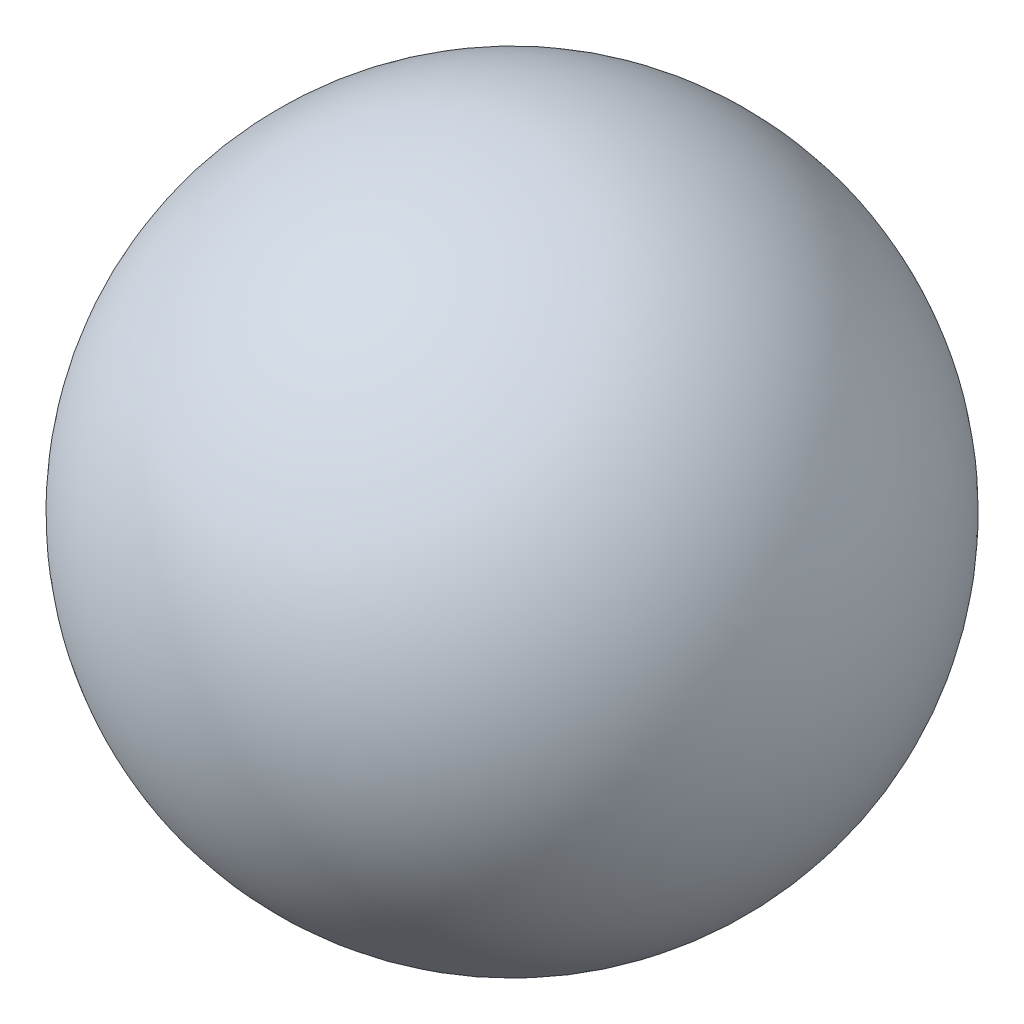
ISO-10303-21;
HEADER;
FILE_DESCRIPTION(('STEP AP214'),'2;1');
FILE_NAME('part.step','',(''),(''),'','','');
FILE_SCHEMA(('AUTOMOTIVE_DESIGN { 1 0 10303 214 1 1 1 1 }'));
ENDSEC;
DATA;
#1=APPLICATION_CONTEXT('core data for automotive mechanical design processes');
#2=APPLICATION_PROTOCOL_DEFINITION('international standard','automotive_design',2000,#1);
#3=PRODUCT_CONTEXT('',#1,'mechanical');
#4=PRODUCT('Part','Part','',(#3));
#5=PRODUCT_RELATED_PRODUCT_CATEGORY('part','',(#4));
#6=PRODUCT_DEFINITION_FORMATION('','',#4);
#7=PRODUCT_DEFINITION_CONTEXT('part definition',#1,'design');
#8=PRODUCT_DEFINITION('design','',#6,#7);
#9=PRODUCT_DEFINITION_SHAPE('','',#8);
#10=(LENGTH_UNIT() NAMED_UNIT(*) SI_UNIT(.MILLI.,.METRE.));
#11=(NAMED_UNIT(*) PLANE_ANGLE_UNIT() SI_UNIT($,.RADIAN.));
#12=(NAMED_UNIT(*) SI_UNIT($,.STERADIAN.) SOLID_ANGLE_UNIT());
#13=UNCERTAINTY_MEASURE_WITH_UNIT(LENGTH_MEASURE(1.E-05),#10,'distance_accuracy_value','');
#14=(GEOMETRIC_REPRESENTATION_CONTEXT(3) GLOBAL_UNCERTAINTY_ASSIGNED_CONTEXT((#13)) GLOBAL_UNIT_ASSIGNED_CONTEXT((#10,
#11,#12)) REPRESENTATION_CONTEXT('',''));
#15=CARTESIAN_POINT('',(0.,0.,0.));
#16=DIRECTION('',(0.,0.,1.));
#17=DIRECTION('',(1.,0.,0.));
#18=AXIS2_PLACEMENT_3D('',#15,#16,#17);
#19=CARTESIAN_POINT('',(0.,0.,-37.));
#20=DIRECTION('',(0.,0.,1.));
#21=DIRECTION('',(-1.,0.,0.));
#22=AXIS2_PLACEMENT_3D('',#19,#20,#21);
#23=SPHERICAL_SURFACE('',#22,37.);
#24=CARTESIAN_POINT('',(0.,0.,0.));
#25=VERTEX_POINT('',#24);
#26=VERTEX_LOOP('',#25);
#27=FACE_BOUND('',#26,.T.);
#28=ADVANCED_FACE('F38',(#27),#23,.T.);
#29=CLOSED_SHELL('',(#28));
#30=MANIFOLD_SOLID_BREP('B2',#29);
#31=ADVANCED_BREP_SHAPE_REPRESENTATION('',(#18,#30),#14);
#32=SHAPE_DEFINITION_REPRESENTATION(#9,#31);
ENDSEC;
END-ISO-10303-21;
